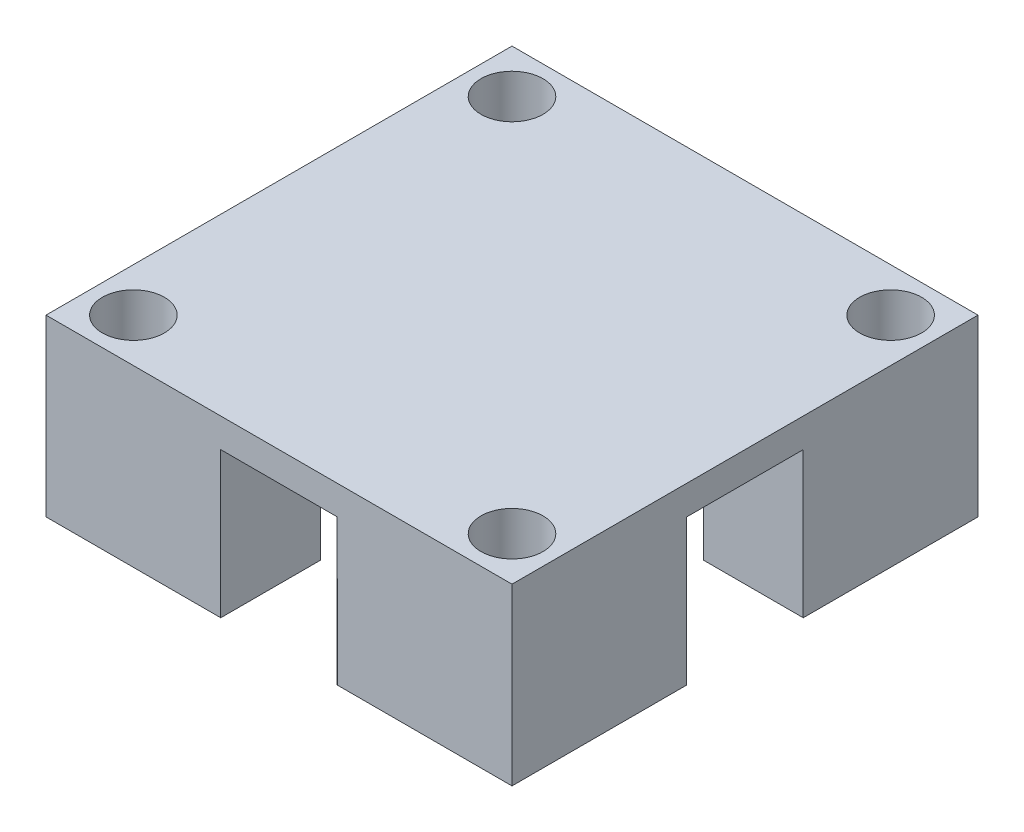
ISO-10303-21;
HEADER;
FILE_DESCRIPTION(('STEP AP214'),'2;1');
FILE_NAME('part.step','',(''),(''),'','','');
FILE_SCHEMA(('AUTOMOTIVE_DESIGN { 1 0 10303 214 1 1 1 1 }'));
ENDSEC;
DATA;
#1=APPLICATION_CONTEXT('core data for automotive mechanical design processes');
#2=APPLICATION_PROTOCOL_DEFINITION('international standard','automotive_design',2000,#1);
#3=PRODUCT_CONTEXT('',#1,'mechanical');
#4=PRODUCT('Part','Part','',(#3));
#5=PRODUCT_RELATED_PRODUCT_CATEGORY('part','',(#4));
#6=PRODUCT_DEFINITION_FORMATION('','',#4);
#7=PRODUCT_DEFINITION_CONTEXT('part definition',#1,'design');
#8=PRODUCT_DEFINITION('design','',#6,#7);
#9=PRODUCT_DEFINITION_SHAPE('','',#8);
#10=(LENGTH_UNIT() NAMED_UNIT(*) SI_UNIT(.MILLI.,.METRE.));
#11=(NAMED_UNIT(*) PLANE_ANGLE_UNIT() SI_UNIT($,.RADIAN.));
#12=(NAMED_UNIT(*) SI_UNIT($,.STERADIAN.) SOLID_ANGLE_UNIT());
#13=UNCERTAINTY_MEASURE_WITH_UNIT(LENGTH_MEASURE(1.E-05),#10,'distance_accuracy_value','');
#14=(GEOMETRIC_REPRESENTATION_CONTEXT(3) GLOBAL_UNCERTAINTY_ASSIGNED_CONTEXT((#13)) GLOBAL_UNIT_ASSIGNED_CONTEXT((#10,
#11,#12)) REPRESENTATION_CONTEXT('',''));
#15=CARTESIAN_POINT('',(0.,0.,0.));
#16=DIRECTION('',(0.,0.,1.));
#17=DIRECTION('',(1.,0.,0.));
#18=AXIS2_PLACEMENT_3D('',#15,#16,#17);
#19=CARTESIAN_POINT('',(25.4,19.05,-25.4));
#20=DIRECTION('',(-1.,0.,0.));
#21=DIRECTION('',(0.,0.,1.));
#22=AXIS2_PLACEMENT_3D('',#19,#20,#21);
#23=PLANE('',#22);
#24=DIRECTION('',(0.,-1.,0.));
#25=VECTOR('',#24,1.);
#26=CARTESIAN_POINT('',(25.4,15.875,6.35));
#27=LINE('',#26,#25);
#28=CARTESIAN_POINT('',(25.4,15.875,6.35));
#29=VERTEX_POINT('',#28);
#30=CARTESIAN_POINT('',(25.4,0.,6.35));
#31=VERTEX_POINT('',#30);
#32=EDGE_CURVE('E297',#29,#31,#27,.T.);
#33=ORIENTED_EDGE('',*,*,#32,.F.);
#34=DIRECTION('',(0.,0.,1.));
#35=VECTOR('',#34,1.);
#36=CARTESIAN_POINT('',(25.4,15.875,0.));
#37=LINE('',#36,#35);
#38=CARTESIAN_POINT('',(25.4,15.875,-6.35));
#39=VERTEX_POINT('',#38);
#40=EDGE_CURVE('E195',#39,#29,#37,.T.);
#41=ORIENTED_EDGE('',*,*,#40,.F.);
#42=DIRECTION('',(0.,-1.,0.));
#43=VECTOR('',#42,1.);
#44=CARTESIAN_POINT('',(25.4,15.875,-6.35));
#45=LINE('',#44,#43);
#46=CARTESIAN_POINT('',(25.4,0.,-6.35));
#47=VERTEX_POINT('',#46);
#48=EDGE_CURVE('E185',#39,#47,#45,.T.);
#49=ORIENTED_EDGE('',*,*,#48,.T.);
#50=DIRECTION('',(0.,0.,-1.));
#51=VECTOR('',#50,1.);
#52=CARTESIAN_POINT('',(25.4,0.,-25.4));
#53=LINE('',#52,#51);
#54=CARTESIAN_POINT('',(25.4,0.,-25.4));
#55=VERTEX_POINT('',#54);
#56=EDGE_CURVE('E323',#47,#55,#53,.T.);
#57=ORIENTED_EDGE('',*,*,#56,.T.);
#58=DIRECTION('',(0.,-1.,0.));
#59=VECTOR('',#58,1.);
#60=CARTESIAN_POINT('',(25.4,19.05,-25.4));
#61=LINE('',#60,#59);
#62=CARTESIAN_POINT('',(25.4,19.05,-25.4));
#63=VERTEX_POINT('',#62);
#64=EDGE_CURVE('E11',#63,#55,#61,.T.);
#65=ORIENTED_EDGE('',*,*,#64,.F.);
#66=DIRECTION('',(0.,0.,-1.));
#67=VECTOR('',#66,1.);
#68=CARTESIAN_POINT('',(25.4,19.05,-25.4));
#69=LINE('',#68,#67);
#70=CARTESIAN_POINT('',(25.4,19.05,25.4));
#71=VERTEX_POINT('',#70);
#72=EDGE_CURVE('E324',#71,#63,#69,.T.);
#73=ORIENTED_EDGE('',*,*,#72,.F.);
#74=DIRECTION('',(0.,-1.,0.));
#75=VECTOR('',#74,1.);
#76=CARTESIAN_POINT('',(25.4,19.05,25.4));
#77=LINE('',#76,#75);
#78=CARTESIAN_POINT('',(25.4,0.,25.4));
#79=VERTEX_POINT('',#78);
#80=EDGE_CURVE('E331',#71,#79,#77,.T.);
#81=ORIENTED_EDGE('',*,*,#80,.T.);
#82=EDGE_CURVE('E332',#79,#31,#53,.T.);
#83=ORIENTED_EDGE('',*,*,#82,.T.);
#84=EDGE_LOOP('',(#33,#41,#49,#57,#65,#73,#81,#83));
#85=FACE_BOUND('',#84,.T.);
#86=ADVANCED_FACE('F35',(#85),#23,.F.);
#87=CARTESIAN_POINT('',(-25.4,19.05,-25.4));
#88=DIRECTION('',(0.,0.,1.));
#89=DIRECTION('',(1.,0.,0.));
#90=AXIS2_PLACEMENT_3D('',#87,#88,#89);
#91=PLANE('',#90);
#92=DIRECTION('',(0.,-1.,0.));
#93=VECTOR('',#92,1.);
#94=CARTESIAN_POINT('',(6.35,15.875,-25.4));
#95=LINE('',#94,#93);
#96=CARTESIAN_POINT('',(6.35,15.875,-25.4));
#97=VERTEX_POINT('',#96);
#98=CARTESIAN_POINT('',(6.35,0.,-25.4));
#99=VERTEX_POINT('',#98);
#100=EDGE_CURVE('E271',#97,#99,#95,.T.);
#101=ORIENTED_EDGE('',*,*,#100,.F.);
#102=DIRECTION('',(1.,0.,0.));
#103=VECTOR('',#102,1.);
#104=CARTESIAN_POINT('',(0.,15.875,-25.4));
#105=LINE('',#104,#103);
#106=CARTESIAN_POINT('',(-6.35,15.875,-25.4));
#107=VERTEX_POINT('',#106);
#108=EDGE_CURVE('E237',#107,#97,#105,.T.);
#109=ORIENTED_EDGE('',*,*,#108,.F.);
#110=DIRECTION('',(0.,-1.,0.));
#111=VECTOR('',#110,1.);
#112=CARTESIAN_POINT('',(-6.35,15.875,-25.4));
#113=LINE('',#112,#111);
#114=CARTESIAN_POINT('',(-6.35,0.,-25.4));
#115=VERTEX_POINT('',#114);
#116=EDGE_CURVE('E273',#107,#115,#113,.T.);
#117=ORIENTED_EDGE('',*,*,#116,.T.);
#118=DIRECTION('',(-1.,0.,0.));
#119=VECTOR('',#118,1.);
#120=CARTESIAN_POINT('',(-25.4,0.,-25.4));
#121=LINE('',#120,#119);
#122=CARTESIAN_POINT('',(-25.4,0.,-25.4));
#123=VERTEX_POINT('',#122);
#124=EDGE_CURVE('E335',#115,#123,#121,.T.);
#125=ORIENTED_EDGE('',*,*,#124,.T.);
#126=DIRECTION('',(0.,-1.,0.));
#127=VECTOR('',#126,1.);
#128=CARTESIAN_POINT('',(-25.4,19.05,-25.4));
#129=LINE('',#128,#127);
#130=CARTESIAN_POINT('',(-25.4,19.05,-25.4));
#131=VERTEX_POINT('',#130);
#132=EDGE_CURVE('E42',#131,#123,#129,.T.);
#133=ORIENTED_EDGE('',*,*,#132,.F.);
#134=DIRECTION('',(-1.,0.,0.));
#135=VECTOR('',#134,1.);
#136=CARTESIAN_POINT('',(-25.4,19.05,-25.4));
#137=LINE('',#136,#135);
#138=EDGE_CURVE('E86',#63,#131,#137,.T.);
#139=ORIENTED_EDGE('',*,*,#138,.F.);
#140=ORIENTED_EDGE('',*,*,#64,.T.);
#141=EDGE_CURVE('E336',#55,#99,#121,.T.);
#142=ORIENTED_EDGE('',*,*,#141,.T.);
#143=EDGE_LOOP('',(#101,#109,#117,#125,#133,#139,#140,#142));
#144=FACE_BOUND('',#143,.T.);
#145=ADVANCED_FACE('F402',(#144),#91,.F.);
#146=CARTESIAN_POINT('',(0.,0.,0.));
#147=DIRECTION('',(0.,1.,0.));
#148=DIRECTION('',(0.,0.,1.));
#149=AXIS2_PLACEMENT_3D('',#146,#147,#148);
#150=PLANE('',#149);
#151=CARTESIAN_POINT('',(-20.6375,0.,20.6375));
#152=DIRECTION('',(0.,1.,0.));
#153=DIRECTION('',(0.,0.,1.));
#154=AXIS2_PLACEMENT_3D('',#151,#152,#153);
#155=CIRCLE('',#154,3.37819999999999);
#156=CARTESIAN_POINT('',(-20.6375,0.,24.0157));
#157=VERTEX_POINT('',#156);
#158=EDGE_CURVE('E320',#157,#157,#155,.T.);
#159=ORIENTED_EDGE('',*,*,#158,.T.);
#160=EDGE_LOOP('',(#159));
#161=FACE_BOUND('',#160,.T.);
#162=DIRECTION('',(1.,0.,0.));
#163=VECTOR('',#162,1.);
#164=CARTESIAN_POINT('',(0.,0.,6.35));
#165=LINE('',#164,#163);
#166=CARTESIAN_POINT('',(-25.4,0.,6.35));
#167=VERTEX_POINT('',#166);
#168=CARTESIAN_POINT('',(-14.5496778314848,0.,6.35));
#169=VERTEX_POINT('',#168);
#170=EDGE_CURVE('E258',#167,#169,#165,.T.);
#171=ORIENTED_EDGE('',*,*,#170,.T.);
#172=CARTESIAN_POINT('',(0.,0.,0.));
#173=DIRECTION('',(0.,-1.,0.));
#174=DIRECTION('',(0.,0.,-1.));
#175=AXIS2_PLACEMENT_3D('',#172,#173,#174);
#176=CIRCLE('',#175,15.875);
#177=CARTESIAN_POINT('',(-6.35,0.,14.5496778314848));
#178=VERTEX_POINT('',#177);
#179=EDGE_CURVE('E255',#178,#169,#176,.T.);
#180=ORIENTED_EDGE('',*,*,#179,.F.);
#181=DIRECTION('',(0.,0.,-1.));
#182=VECTOR('',#181,1.);
#183=CARTESIAN_POINT('',(-6.35,0.,0.));
#184=LINE('',#183,#182);
#185=CARTESIAN_POINT('',(-6.35,0.,25.4));
#186=VERTEX_POINT('',#185);
#187=EDGE_CURVE('E252',#186,#178,#184,.T.);
#188=ORIENTED_EDGE('',*,*,#187,.F.);
#189=DIRECTION('',(1.,0.,0.));
#190=VECTOR('',#189,1.);
#191=CARTESIAN_POINT('',(-25.4,0.,25.4));
#192=LINE('',#191,#190);
#193=CARTESIAN_POINT('',(-25.4,0.,25.4));
#194=VERTEX_POINT('',#193);
#195=EDGE_CURVE('E326',#194,#186,#192,.T.);
#196=ORIENTED_EDGE('',*,*,#195,.F.);
#197=DIRECTION('',(0.,0.,1.));
#198=VECTOR('',#197,1.);
#199=CARTESIAN_POINT('',(-25.4,0.,-25.4));
#200=LINE('',#199,#198);
#201=EDGE_CURVE('E339',#167,#194,#200,.T.);
#202=ORIENTED_EDGE('',*,*,#201,.F.);
#203=EDGE_LOOP('',(#171,#180,#188,#196,#202));
#204=FACE_BOUND('',#203,.T.);
#205=ADVANCED_FACE('F376',(#161,#204),#150,.F.);
#206=CARTESIAN_POINT('',(20.6375,0.,20.6375));
#207=DIRECTION('',(0.,1.,0.));
#208=DIRECTION('',(0.,0.,1.));
#209=AXIS2_PLACEMENT_3D('',#206,#207,#208);
#210=CIRCLE('',#209,3.37819999999999);
#211=CARTESIAN_POINT('',(20.6375,0.,24.0157));
#212=VERTEX_POINT('',#211);
#213=EDGE_CURVE('E314',#212,#212,#210,.T.);
#214=ORIENTED_EDGE('',*,*,#213,.T.);
#215=EDGE_LOOP('',(#214));
#216=FACE_BOUND('',#215,.T.);
#217=DIRECTION('',(0.,0.,-1.));
#218=VECTOR('',#217,1.);
#219=CARTESIAN_POINT('',(6.35,0.,0.));
#220=LINE('',#219,#218);
#221=CARTESIAN_POINT('',(6.35,0.,25.4));
#222=VERTEX_POINT('',#221);
#223=CARTESIAN_POINT('',(6.35,0.,14.5496778314848));
#224=VERTEX_POINT('',#223);
#225=EDGE_CURVE('E249',#222,#224,#220,.T.);
#226=ORIENTED_EDGE('',*,*,#225,.T.);
#227=CARTESIAN_POINT('',(0.,0.,0.));
#228=DIRECTION('',(0.,-1.,0.));
#229=DIRECTION('',(0.,0.,-1.));
#230=AXIS2_PLACEMENT_3D('',#227,#228,#229);
#231=CIRCLE('',#230,15.875);
#232=CARTESIAN_POINT('',(14.5496778314848,0.,6.35));
#233=VERTEX_POINT('',#232);
#234=EDGE_CURVE('E246',#233,#224,#231,.T.);
#235=ORIENTED_EDGE('',*,*,#234,.F.);
#236=DIRECTION('',(1.,0.,0.));
#237=VECTOR('',#236,1.);
#238=CARTESIAN_POINT('',(0.,0.,6.35));
#239=LINE('',#238,#237);
#240=EDGE_CURVE('E243',#233,#31,#239,.T.);
#241=ORIENTED_EDGE('',*,*,#240,.T.);
#242=ORIENTED_EDGE('',*,*,#82,.F.);
#243=EDGE_CURVE('E79',#222,#79,#192,.T.);
#244=ORIENTED_EDGE('',*,*,#243,.F.);
#245=EDGE_LOOP('',(#226,#235,#241,#242,#244));
#246=FACE_BOUND('',#245,.T.);
#247=ADVANCED_FACE('F409',(#216,#246),#150,.F.);
#248=CARTESIAN_POINT('',(20.6375,0.,-20.6375));
#249=DIRECTION('',(0.,1.,0.));
#250=DIRECTION('',(0.,0.,1.));
#251=AXIS2_PLACEMENT_3D('',#248,#249,#250);
#252=CIRCLE('',#251,3.37819999999999);
#253=CARTESIAN_POINT('',(20.6375,0.,-17.2593));
#254=VERTEX_POINT('',#253);
#255=EDGE_CURVE('E308',#254,#254,#252,.T.);
#256=ORIENTED_EDGE('',*,*,#255,.T.);
#257=EDGE_LOOP('',(#256));
#258=FACE_BOUND('',#257,.T.);
#259=DIRECTION('',(0.,0.,-1.));
#260=VECTOR('',#259,1.);
#261=CARTESIAN_POINT('',(6.35,0.,0.));
#262=LINE('',#261,#260);
#263=CARTESIAN_POINT('',(6.35,0.,-14.5496778314848));
#264=VERTEX_POINT('',#263);
#265=EDGE_CURVE('E200',#264,#99,#262,.T.);
#266=ORIENTED_EDGE('',*,*,#265,.T.);
#267=ORIENTED_EDGE('',*,*,#141,.F.);
#268=ORIENTED_EDGE('',*,*,#56,.F.);
#269=DIRECTION('',(1.,0.,0.));
#270=VECTOR('',#269,1.);
#271=CARTESIAN_POINT('',(0.,0.,-6.35));
#272=LINE('',#271,#270);
#273=CARTESIAN_POINT('',(14.5496778314848,0.,-6.35));
#274=VERTEX_POINT('',#273);
#275=EDGE_CURVE('E241',#274,#47,#272,.T.);
#276=ORIENTED_EDGE('',*,*,#275,.F.);
#277=CARTESIAN_POINT('',(0.,0.,0.));
#278=DIRECTION('',(0.,-1.,0.));
#279=DIRECTION('',(0.,0.,-1.));
#280=AXIS2_PLACEMENT_3D('',#277,#278,#279);
#281=CIRCLE('',#280,15.875);
#282=EDGE_CURVE('E49',#264,#274,#281,.T.);
#283=ORIENTED_EDGE('',*,*,#282,.F.);
#284=EDGE_LOOP('',(#266,#267,#268,#276,#283));
#285=FACE_BOUND('',#284,.T.);
#286=ADVANCED_FACE('F396',(#258,#285),#150,.F.);
#287=CARTESIAN_POINT('',(-25.4,19.05,-25.4));
#288=DIRECTION('',(1.,0.,0.));
#289=DIRECTION('',(0.,0.,-1.));
#290=AXIS2_PLACEMENT_3D('',#287,#288,#289);
#291=PLANE('',#290);
#292=CARTESIAN_POINT('',(-25.4,0.,-6.35));
#293=VERTEX_POINT('',#292);
#294=EDGE_CURVE('E340',#123,#293,#200,.T.);
#295=ORIENTED_EDGE('',*,*,#294,.T.);
#296=DIRECTION('',(0.,-1.,0.));
#297=VECTOR('',#296,1.);
#298=CARTESIAN_POINT('',(-25.4,15.875,-6.35));
#299=LINE('',#298,#297);
#300=CARTESIAN_POINT('',(-25.4,15.875,-6.35));
#301=VERTEX_POINT('',#300);
#302=EDGE_CURVE('E280',#301,#293,#299,.T.);
#303=ORIENTED_EDGE('',*,*,#302,.F.);
#304=DIRECTION('',(0.,0.,-1.));
#305=VECTOR('',#304,1.);
#306=CARTESIAN_POINT('',(-25.4,15.875,0.));
#307=LINE('',#306,#305);
#308=CARTESIAN_POINT('',(-25.4,15.875,6.35));
#309=VERTEX_POINT('',#308);
#310=EDGE_CURVE('E225',#309,#301,#307,.T.);
#311=ORIENTED_EDGE('',*,*,#310,.F.);
#312=DIRECTION('',(0.,-1.,0.));
#313=VECTOR('',#312,1.);
#314=CARTESIAN_POINT('',(-25.4,15.875,6.35));
#315=LINE('',#314,#313);
#316=EDGE_CURVE('E282',#309,#167,#315,.T.);
#317=ORIENTED_EDGE('',*,*,#316,.T.);
#318=ORIENTED_EDGE('',*,*,#201,.T.);
#319=DIRECTION('',(0.,-1.,0.));
#320=VECTOR('',#319,1.);
#321=CARTESIAN_POINT('',(-25.4,19.05,25.4));
#322=LINE('',#321,#320);
#323=CARTESIAN_POINT('',(-25.4,19.05,25.4));
#324=VERTEX_POINT('',#323);
#325=EDGE_CURVE('E346',#324,#194,#322,.T.);
#326=ORIENTED_EDGE('',*,*,#325,.F.);
#327=DIRECTION('',(0.,0.,1.));
#328=VECTOR('',#327,1.);
#329=CARTESIAN_POINT('',(-25.4,19.05,-25.4));
#330=LINE('',#329,#328);
#331=EDGE_CURVE('E328',#131,#324,#330,.T.);
#332=ORIENTED_EDGE('',*,*,#331,.F.);
#333=ORIENTED_EDGE('',*,*,#132,.T.);
#334=EDGE_LOOP('',(#295,#303,#311,#317,#318,#326,#332,#333));
#335=FACE_BOUND('',#334,.T.);
#336=ADVANCED_FACE('F352',(#335),#291,.F.);
#337=CARTESIAN_POINT('',(-25.4,19.05,25.4));
#338=DIRECTION('',(0.,0.,-1.));
#339=DIRECTION('',(-1.,0.,0.));
#340=AXIS2_PLACEMENT_3D('',#337,#338,#339);
#341=PLANE('',#340);
#342=ORIENTED_EDGE('',*,*,#195,.T.);
#343=DIRECTION('',(0.,-1.,0.));
#344=VECTOR('',#343,1.);
#345=CARTESIAN_POINT('',(-6.35,15.875,25.4));
#346=LINE('',#345,#344);
#347=CARTESIAN_POINT('',(-6.35,15.875,25.4));
#348=VERTEX_POINT('',#347);
#349=EDGE_CURVE('E289',#348,#186,#346,.T.);
#350=ORIENTED_EDGE('',*,*,#349,.F.);
#351=DIRECTION('',(-1.,0.,0.));
#352=VECTOR('',#351,1.);
#353=CARTESIAN_POINT('',(0.,15.875,25.4));
#354=LINE('',#353,#352);
#355=CARTESIAN_POINT('',(6.35,15.875,25.4));
#356=VERTEX_POINT('',#355);
#357=EDGE_CURVE('E214',#356,#348,#354,.T.);
#358=ORIENTED_EDGE('',*,*,#357,.F.);
#359=DIRECTION('',(0.,-1.,0.));
#360=VECTOR('',#359,1.);
#361=CARTESIAN_POINT('',(6.35,15.875,25.4));
#362=LINE('',#361,#360);
#363=EDGE_CURVE('E291',#356,#222,#362,.T.);
#364=ORIENTED_EDGE('',*,*,#363,.T.);
#365=ORIENTED_EDGE('',*,*,#243,.T.);
#366=ORIENTED_EDGE('',*,*,#80,.F.);
#367=DIRECTION('',(1.,0.,0.));
#368=VECTOR('',#367,1.);
#369=CARTESIAN_POINT('',(-25.4,19.05,25.4));
#370=LINE('',#369,#368);
#371=EDGE_CURVE('E58',#324,#71,#370,.T.);
#372=ORIENTED_EDGE('',*,*,#371,.F.);
#373=ORIENTED_EDGE('',*,*,#325,.T.);
#374=EDGE_LOOP('',(#342,#350,#358,#364,#365,#366,#372,#373));
#375=FACE_BOUND('',#374,.T.);
#376=ADVANCED_FACE('F378',(#375),#341,.F.);
#377=CARTESIAN_POINT('',(0.,19.05,0.));
#378=DIRECTION('',(0.,1.,0.));
#379=DIRECTION('',(0.,0.,1.));
#380=AXIS2_PLACEMENT_3D('',#377,#378,#379);
#381=PLANE('',#380);
#382=CARTESIAN_POINT('',(-20.6375,19.05,-20.6375));
#383=DIRECTION('',(0.,1.,0.));
#384=DIRECTION('',(0.,0.,1.));
#385=AXIS2_PLACEMENT_3D('',#382,#383,#384);
#386=CIRCLE('',#385,3.37819999999999);
#387=CARTESIAN_POINT('',(-20.6375,19.05,-17.2593));
#388=VERTEX_POINT('',#387);
#389=EDGE_CURVE('E270',#388,#388,#386,.T.);
#390=ORIENTED_EDGE('',*,*,#389,.F.);
#391=EDGE_LOOP('',(#390));
#392=FACE_BOUND('',#391,.T.);
#393=CARTESIAN_POINT('',(20.6375,19.05,-20.6375));
#394=DIRECTION('',(0.,1.,0.));
#395=DIRECTION('',(0.,0.,1.));
#396=AXIS2_PLACEMENT_3D('',#393,#394,#395);
#397=CIRCLE('',#396,3.37819999999999);
#398=CARTESIAN_POINT('',(20.6375,19.05,-17.2593));
#399=VERTEX_POINT('',#398);
#400=EDGE_CURVE('E305',#399,#399,#397,.T.);
#401=ORIENTED_EDGE('',*,*,#400,.F.);
#402=EDGE_LOOP('',(#401));
#403=FACE_BOUND('',#402,.T.);
#404=CARTESIAN_POINT('',(20.6375,19.05,20.6375));
#405=DIRECTION('',(0.,1.,0.));
#406=DIRECTION('',(0.,0.,1.));
#407=AXIS2_PLACEMENT_3D('',#404,#405,#406);
#408=CIRCLE('',#407,3.37819999999999);
#409=CARTESIAN_POINT('',(20.6375,19.05,24.0157));
#410=VERTEX_POINT('',#409);
#411=EDGE_CURVE('E311',#410,#410,#408,.T.);
#412=ORIENTED_EDGE('',*,*,#411,.F.);
#413=EDGE_LOOP('',(#412));
#414=FACE_BOUND('',#413,.T.);
#415=CARTESIAN_POINT('',(-20.6375,19.05,20.6375));
#416=DIRECTION('',(0.,1.,0.));
#417=DIRECTION('',(0.,0.,1.));
#418=AXIS2_PLACEMENT_3D('',#415,#416,#417);
#419=CIRCLE('',#418,3.37819999999999);
#420=CARTESIAN_POINT('',(-20.6375,19.05,24.0157));
#421=VERTEX_POINT('',#420);
#422=EDGE_CURVE('E317',#421,#421,#419,.T.);
#423=ORIENTED_EDGE('',*,*,#422,.F.);
#424=EDGE_LOOP('',(#423));
#425=FACE_BOUND('',#424,.T.);
#426=ORIENTED_EDGE('',*,*,#72,.T.);
#427=ORIENTED_EDGE('',*,*,#138,.T.);
#428=ORIENTED_EDGE('',*,*,#331,.T.);
#429=ORIENTED_EDGE('',*,*,#371,.T.);
#430=EDGE_LOOP('',(#426,#427,#428,#429));
#431=FACE_BOUND('',#430,.T.);
#432=ADVANCED_FACE('F385',(#392,#403,#414,#425,#431),#381,.T.);
#433=CARTESIAN_POINT('',(-20.6375,0.,-20.6375));
#434=DIRECTION('',(0.,1.,0.));
#435=DIRECTION('',(0.,0.,1.));
#436=AXIS2_PLACEMENT_3D('',#433,#434,#435);
#437=CIRCLE('',#436,3.37819999999999);
#438=CARTESIAN_POINT('',(-20.6375,0.,-17.2593));
#439=VERTEX_POINT('',#438);
#440=EDGE_CURVE('E302',#439,#439,#437,.T.);
#441=ORIENTED_EDGE('',*,*,#440,.T.);
#442=EDGE_LOOP('',(#441));
#443=FACE_BOUND('',#442,.T.);
#444=ORIENTED_EDGE('',*,*,#124,.F.);
#445=DIRECTION('',(0.,0.,-1.));
#446=VECTOR('',#445,1.);
#447=CARTESIAN_POINT('',(-6.35,0.,0.));
#448=LINE('',#447,#446);
#449=CARTESIAN_POINT('',(-6.35,0.,-14.5496778314848));
#450=VERTEX_POINT('',#449);
#451=EDGE_CURVE('E203',#450,#115,#448,.T.);
#452=ORIENTED_EDGE('',*,*,#451,.F.);
#453=CARTESIAN_POINT('',(0.,0.,0.));
#454=DIRECTION('',(0.,-1.,0.));
#455=DIRECTION('',(0.,0.,-1.));
#456=AXIS2_PLACEMENT_3D('',#453,#454,#455);
#457=CIRCLE('',#456,15.875);
#458=CARTESIAN_POINT('',(-14.5496778314848,0.,-6.35));
#459=VERTEX_POINT('',#458);
#460=EDGE_CURVE('E264',#459,#450,#457,.T.);
#461=ORIENTED_EDGE('',*,*,#460,.F.);
#462=DIRECTION('',(1.,0.,0.));
#463=VECTOR('',#462,1.);
#464=CARTESIAN_POINT('',(0.,0.,-6.35));
#465=LINE('',#464,#463);
#466=EDGE_CURVE('E261',#293,#459,#465,.T.);
#467=ORIENTED_EDGE('',*,*,#466,.F.);
#468=ORIENTED_EDGE('',*,*,#294,.F.);
#469=EDGE_LOOP('',(#444,#452,#461,#467,#468));
#470=FACE_BOUND('',#469,.T.);
#471=ADVANCED_FACE('F358',(#443,#470),#150,.F.);
#472=CARTESIAN_POINT('',(-20.6375,19.05,20.6375));
#473=DIRECTION('',(0.,1.,0.));
#474=DIRECTION('',(0.,0.,1.));
#475=AXIS2_PLACEMENT_3D('',#472,#473,#474);
#476=CYLINDRICAL_SURFACE('',#475,3.37819999999999);
#477=ORIENTED_EDGE('',*,*,#158,.F.);
#478=EDGE_LOOP('',(#477));
#479=FACE_BOUND('',#478,.T.);
#480=ORIENTED_EDGE('',*,*,#422,.T.);
#481=EDGE_LOOP('',(#480));
#482=FACE_BOUND('',#481,.T.);
#483=ADVANCED_FACE('F393',(#479,#482),#476,.F.);
#484=CARTESIAN_POINT('',(20.6375,19.05,20.6375));
#485=DIRECTION('',(0.,1.,0.));
#486=DIRECTION('',(0.,0.,1.));
#487=AXIS2_PLACEMENT_3D('',#484,#485,#486);
#488=CYLINDRICAL_SURFACE('',#487,3.37819999999999);
#489=ORIENTED_EDGE('',*,*,#213,.F.);
#490=EDGE_LOOP('',(#489));
#491=FACE_BOUND('',#490,.T.);
#492=ORIENTED_EDGE('',*,*,#411,.T.);
#493=EDGE_LOOP('',(#492));
#494=FACE_BOUND('',#493,.T.);
#495=ADVANCED_FACE('F476',(#491,#494),#488,.F.);
#496=CARTESIAN_POINT('',(20.6375,19.05,-20.6375));
#497=DIRECTION('',(0.,1.,0.));
#498=DIRECTION('',(0.,0.,1.));
#499=AXIS2_PLACEMENT_3D('',#496,#497,#498);
#500=CYLINDRICAL_SURFACE('',#499,3.37819999999999);
#501=ORIENTED_EDGE('',*,*,#255,.F.);
#502=EDGE_LOOP('',(#501));
#503=FACE_BOUND('',#502,.T.);
#504=ORIENTED_EDGE('',*,*,#400,.T.);
#505=EDGE_LOOP('',(#504));
#506=FACE_BOUND('',#505,.T.);
#507=ADVANCED_FACE('F472',(#503,#506),#500,.F.);
#508=CARTESIAN_POINT('',(-20.6375,19.05,-20.6375));
#509=DIRECTION('',(0.,1.,0.));
#510=DIRECTION('',(0.,0.,1.));
#511=AXIS2_PLACEMENT_3D('',#508,#509,#510);
#512=CYLINDRICAL_SURFACE('',#511,3.37819999999999);
#513=ORIENTED_EDGE('',*,*,#440,.F.);
#514=EDGE_LOOP('',(#513));
#515=FACE_BOUND('',#514,.T.);
#516=ORIENTED_EDGE('',*,*,#389,.T.);
#517=EDGE_LOOP('',(#516));
#518=FACE_BOUND('',#517,.T.);
#519=ADVANCED_FACE('F469',(#515,#518),#512,.F.);
#520=CARTESIAN_POINT('',(0.,15.875,0.));
#521=DIRECTION('',(0.,-1.,0.));
#522=DIRECTION('',(0.,0.,-1.));
#523=AXIS2_PLACEMENT_3D('',#520,#521,#522);
#524=CYLINDRICAL_SURFACE('',#523,15.875);
#525=ORIENTED_EDGE('',*,*,#282,.T.);
#526=DIRECTION('',(0.,-1.,0.));
#527=VECTOR('',#526,1.);
#528=CARTESIAN_POINT('',(14.5496778314848,15.875,-6.35));
#529=LINE('',#528,#527);
#530=CARTESIAN_POINT('',(14.5496778314848,15.875,-6.35));
#531=VERTEX_POINT('',#530);
#532=EDGE_CURVE('E178',#531,#274,#529,.T.);
#533=ORIENTED_EDGE('',*,*,#532,.F.);
#534=CARTESIAN_POINT('',(0.,15.875,0.));
#535=DIRECTION('',(0.,-1.,0.));
#536=DIRECTION('',(0.,0.,-1.));
#537=AXIS2_PLACEMENT_3D('',#534,#535,#536);
#538=CIRCLE('',#537,15.875);
#539=CARTESIAN_POINT('',(6.35,15.875,-14.5496778314848));
#540=VERTEX_POINT('',#539);
#541=EDGE_CURVE('E182',#540,#531,#538,.T.);
#542=ORIENTED_EDGE('',*,*,#541,.F.);
#543=DIRECTION('',(0.,-1.,0.));
#544=VECTOR('',#543,1.);
#545=CARTESIAN_POINT('',(6.35,15.875,-14.5496778314848));
#546=LINE('',#545,#544);
#547=EDGE_CURVE('E268',#540,#264,#546,.T.);
#548=ORIENTED_EDGE('',*,*,#547,.T.);
#549=EDGE_LOOP('',(#525,#533,#542,#548));
#550=FACE_BOUND('',#549,.T.);
#551=ADVANCED_FACE('F180',(#550),#524,.F.);
#552=CARTESIAN_POINT('',(6.35,15.875,0.));
#553=DIRECTION('',(-1.,0.,0.));
#554=DIRECTION('',(0.,0.,1.));
#555=AXIS2_PLACEMENT_3D('',#552,#553,#554);
#556=PLANE('',#555);
#557=ORIENTED_EDGE('',*,*,#265,.F.);
#558=ORIENTED_EDGE('',*,*,#547,.F.);
#559=DIRECTION('',(0.,0.,-1.));
#560=VECTOR('',#559,1.);
#561=CARTESIAN_POINT('',(6.35,15.875,0.));
#562=LINE('',#561,#560);
#563=EDGE_CURVE('E186',#540,#97,#562,.T.);
#564=ORIENTED_EDGE('',*,*,#563,.T.);
#565=ORIENTED_EDGE('',*,*,#100,.T.);
#566=EDGE_LOOP('',(#557,#558,#564,#565));
#567=FACE_BOUND('',#566,.T.);
#568=ADVANCED_FACE('F429',(#567),#556,.T.);
#569=CARTESIAN_POINT('',(-6.35,15.875,0.));
#570=DIRECTION('',(-1.,0.,0.));
#571=DIRECTION('',(0.,0.,1.));
#572=AXIS2_PLACEMENT_3D('',#569,#570,#571);
#573=PLANE('',#572);
#574=ORIENTED_EDGE('',*,*,#451,.T.);
#575=ORIENTED_EDGE('',*,*,#116,.F.);
#576=DIRECTION('',(0.,0.,-1.));
#577=VECTOR('',#576,1.);
#578=CARTESIAN_POINT('',(-6.35,15.875,0.));
#579=LINE('',#578,#577);
#580=CARTESIAN_POINT('',(-6.35,15.875,-14.5496778314848));
#581=VERTEX_POINT('',#580);
#582=EDGE_CURVE('E234',#581,#107,#579,.T.);
#583=ORIENTED_EDGE('',*,*,#582,.F.);
#584=DIRECTION('',(0.,-1.,0.));
#585=VECTOR('',#584,1.);
#586=CARTESIAN_POINT('',(-6.35,15.875,-14.5496778314848));
#587=LINE('',#586,#585);
#588=EDGE_CURVE('E276',#581,#450,#587,.T.);
#589=ORIENTED_EDGE('',*,*,#588,.T.);
#590=EDGE_LOOP('',(#574,#575,#583,#589));
#591=FACE_BOUND('',#590,.T.);
#592=ADVANCED_FACE('F432',(#591),#573,.F.);
#593=CARTESIAN_POINT('',(0.,15.875,0.));
#594=DIRECTION('',(0.,-1.,0.));
#595=DIRECTION('',(0.,0.,-1.));
#596=AXIS2_PLACEMENT_3D('',#593,#594,#595);
#597=CYLINDRICAL_SURFACE('',#596,15.875);
#598=ORIENTED_EDGE('',*,*,#460,.T.);
#599=ORIENTED_EDGE('',*,*,#588,.F.);
#600=CARTESIAN_POINT('',(0.,15.875,0.));
#601=DIRECTION('',(0.,-1.,0.));
#602=DIRECTION('',(0.,0.,-1.));
#603=AXIS2_PLACEMENT_3D('',#600,#601,#602);
#604=CIRCLE('',#603,15.875);
#605=CARTESIAN_POINT('',(-14.5496778314848,15.875,-6.35));
#606=VERTEX_POINT('',#605);
#607=EDGE_CURVE('E231',#606,#581,#604,.T.);
#608=ORIENTED_EDGE('',*,*,#607,.F.);
#609=DIRECTION('',(0.,-1.,0.));
#610=VECTOR('',#609,1.);
#611=CARTESIAN_POINT('',(-14.5496778314848,15.875,-6.35));
#612=LINE('',#611,#610);
#613=EDGE_CURVE('E278',#606,#459,#612,.T.);
#614=ORIENTED_EDGE('',*,*,#613,.T.);
#615=EDGE_LOOP('',(#598,#599,#608,#614));
#616=FACE_BOUND('',#615,.T.);
#617=ADVANCED_FACE('F434',(#616),#597,.F.);
#618=CARTESIAN_POINT('',(0.,15.875,-6.35));
#619=DIRECTION('',(0.,0.,-1.));
#620=DIRECTION('',(-1.,0.,0.));
#621=AXIS2_PLACEMENT_3D('',#618,#619,#620);
#622=PLANE('',#621);
#623=ORIENTED_EDGE('',*,*,#466,.T.);
#624=ORIENTED_EDGE('',*,*,#613,.F.);
#625=DIRECTION('',(1.,0.,0.));
#626=VECTOR('',#625,1.);
#627=CARTESIAN_POINT('',(0.,15.875,-6.35));
#628=LINE('',#627,#626);
#629=EDGE_CURVE('E228',#301,#606,#628,.T.);
#630=ORIENTED_EDGE('',*,*,#629,.F.);
#631=ORIENTED_EDGE('',*,*,#302,.T.);
#632=EDGE_LOOP('',(#623,#624,#630,#631));
#633=FACE_BOUND('',#632,.T.);
#634=ADVANCED_FACE('F362',(#633),#622,.F.);
#635=CARTESIAN_POINT('',(0.,15.875,6.35));
#636=DIRECTION('',(0.,0.,-1.));
#637=DIRECTION('',(-1.,0.,0.));
#638=AXIS2_PLACEMENT_3D('',#635,#636,#637);
#639=PLANE('',#638);
#640=ORIENTED_EDGE('',*,*,#170,.F.);
#641=ORIENTED_EDGE('',*,*,#316,.F.);
#642=DIRECTION('',(1.,0.,0.));
#643=VECTOR('',#642,1.);
#644=CARTESIAN_POINT('',(0.,15.875,6.35));
#645=LINE('',#644,#643);
#646=CARTESIAN_POINT('',(-14.5496778314848,15.875,6.35));
#647=VERTEX_POINT('',#646);
#648=EDGE_CURVE('E223',#309,#647,#645,.T.);
#649=ORIENTED_EDGE('',*,*,#648,.T.);
#650=DIRECTION('',(0.,-1.,0.));
#651=VECTOR('',#650,1.);
#652=CARTESIAN_POINT('',(-14.5496778314848,15.875,6.35));
#653=LINE('',#652,#651);
#654=EDGE_CURVE('E285',#647,#169,#653,.T.);
#655=ORIENTED_EDGE('',*,*,#654,.T.);
#656=EDGE_LOOP('',(#640,#641,#649,#655));
#657=FACE_BOUND('',#656,.T.);
#658=ADVANCED_FACE('F370',(#657),#639,.T.);
#659=CARTESIAN_POINT('',(0.,15.875,0.));
#660=DIRECTION('',(0.,-1.,0.));
#661=DIRECTION('',(0.,0.,-1.));
#662=AXIS2_PLACEMENT_3D('',#659,#660,#661);
#663=CYLINDRICAL_SURFACE('',#662,15.875);
#664=ORIENTED_EDGE('',*,*,#179,.T.);
#665=ORIENTED_EDGE('',*,*,#654,.F.);
#666=CARTESIAN_POINT('',(0.,15.875,0.));
#667=DIRECTION('',(0.,-1.,0.));
#668=DIRECTION('',(0.,0.,-1.));
#669=AXIS2_PLACEMENT_3D('',#666,#667,#668);
#670=CIRCLE('',#669,15.875);
#671=CARTESIAN_POINT('',(-6.35,15.875,14.5496778314848));
#672=VERTEX_POINT('',#671);
#673=EDGE_CURVE('E220',#672,#647,#670,.T.);
#674=ORIENTED_EDGE('',*,*,#673,.F.);
#675=DIRECTION('',(0.,-1.,0.));
#676=VECTOR('',#675,1.);
#677=CARTESIAN_POINT('',(-6.35,15.875,14.5496778314848));
#678=LINE('',#677,#676);
#679=EDGE_CURVE('E287',#672,#178,#678,.T.);
#680=ORIENTED_EDGE('',*,*,#679,.T.);
#681=EDGE_LOOP('',(#664,#665,#674,#680));
#682=FACE_BOUND('',#681,.T.);
#683=ADVANCED_FACE('F372',(#682),#663,.F.);
#684=CARTESIAN_POINT('',(-6.35,15.875,0.));
#685=DIRECTION('',(-1.,0.,0.));
#686=DIRECTION('',(0.,0.,1.));
#687=AXIS2_PLACEMENT_3D('',#684,#685,#686);
#688=PLANE('',#687);
#689=ORIENTED_EDGE('',*,*,#187,.T.);
#690=ORIENTED_EDGE('',*,*,#679,.F.);
#691=DIRECTION('',(0.,0.,-1.));
#692=VECTOR('',#691,1.);
#693=CARTESIAN_POINT('',(-6.35,15.875,0.));
#694=LINE('',#693,#692);
#695=EDGE_CURVE('E217',#348,#672,#694,.T.);
#696=ORIENTED_EDGE('',*,*,#695,.F.);
#697=ORIENTED_EDGE('',*,*,#349,.T.);
#698=EDGE_LOOP('',(#689,#690,#696,#697));
#699=FACE_BOUND('',#698,.T.);
#700=ADVANCED_FACE('F449',(#699),#688,.F.);
#701=CARTESIAN_POINT('',(6.35,15.875,0.));
#702=DIRECTION('',(-1.,0.,0.));
#703=DIRECTION('',(0.,0.,1.));
#704=AXIS2_PLACEMENT_3D('',#701,#702,#703);
#705=PLANE('',#704);
#706=ORIENTED_EDGE('',*,*,#225,.F.);
#707=ORIENTED_EDGE('',*,*,#363,.F.);
#708=DIRECTION('',(0.,0.,-1.));
#709=VECTOR('',#708,1.);
#710=CARTESIAN_POINT('',(6.35,15.875,0.));
#711=LINE('',#710,#709);
#712=CARTESIAN_POINT('',(6.35,15.875,14.5496778314848));
#713=VERTEX_POINT('',#712);
#714=EDGE_CURVE('E212',#356,#713,#711,.T.);
#715=ORIENTED_EDGE('',*,*,#714,.T.);
#716=DIRECTION('',(0.,-1.,0.));
#717=VECTOR('',#716,1.);
#718=CARTESIAN_POINT('',(6.35,15.875,14.5496778314848));
#719=LINE('',#718,#717);
#720=EDGE_CURVE('E293',#713,#224,#719,.T.);
#721=ORIENTED_EDGE('',*,*,#720,.T.);
#722=EDGE_LOOP('',(#706,#707,#715,#721));
#723=FACE_BOUND('',#722,.T.);
#724=ADVANCED_FACE('F452',(#723),#705,.T.);
#725=CARTESIAN_POINT('',(0.,15.875,0.));
#726=DIRECTION('',(0.,-1.,0.));
#727=DIRECTION('',(0.,0.,-1.));
#728=AXIS2_PLACEMENT_3D('',#725,#726,#727);
#729=CYLINDRICAL_SURFACE('',#728,15.875);
#730=ORIENTED_EDGE('',*,*,#234,.T.);
#731=ORIENTED_EDGE('',*,*,#720,.F.);
#732=CARTESIAN_POINT('',(0.,15.875,0.));
#733=DIRECTION('',(0.,-1.,0.));
#734=DIRECTION('',(0.,0.,-1.));
#735=AXIS2_PLACEMENT_3D('',#732,#733,#734);
#736=CIRCLE('',#735,15.875);
#737=CARTESIAN_POINT('',(14.5496778314848,15.875,6.35));
#738=VERTEX_POINT('',#737);
#739=EDGE_CURVE('E209',#738,#713,#736,.T.);
#740=ORIENTED_EDGE('',*,*,#739,.F.);
#741=DIRECTION('',(0.,-1.,0.));
#742=VECTOR('',#741,1.);
#743=CARTESIAN_POINT('',(14.5496778314848,15.875,6.35));
#744=LINE('',#743,#742);
#745=EDGE_CURVE('E295',#738,#233,#744,.T.);
#746=ORIENTED_EDGE('',*,*,#745,.T.);
#747=EDGE_LOOP('',(#730,#731,#740,#746));
#748=FACE_BOUND('',#747,.T.);
#749=ADVANCED_FACE('F456',(#748),#729,.F.);
#750=CARTESIAN_POINT('',(0.,15.875,6.35));
#751=DIRECTION('',(0.,0.,-1.));
#752=DIRECTION('',(-1.,0.,0.));
#753=AXIS2_PLACEMENT_3D('',#750,#751,#752);
#754=PLANE('',#753);
#755=ORIENTED_EDGE('',*,*,#240,.F.);
#756=ORIENTED_EDGE('',*,*,#745,.F.);
#757=DIRECTION('',(1.,0.,0.));
#758=VECTOR('',#757,1.);
#759=CARTESIAN_POINT('',(0.,15.875,6.35));
#760=LINE('',#759,#758);
#761=EDGE_CURVE('E207',#738,#29,#760,.T.);
#762=ORIENTED_EDGE('',*,*,#761,.T.);
#763=ORIENTED_EDGE('',*,*,#32,.T.);
#764=EDGE_LOOP('',(#755,#756,#762,#763));
#765=FACE_BOUND('',#764,.T.);
#766=ADVANCED_FACE('F460',(#765),#754,.T.);
#767=CARTESIAN_POINT('',(0.,15.875,-6.35));
#768=DIRECTION('',(0.,0.,-1.));
#769=DIRECTION('',(-1.,0.,0.));
#770=AXIS2_PLACEMENT_3D('',#767,#768,#769);
#771=PLANE('',#770);
#772=ORIENTED_EDGE('',*,*,#275,.T.);
#773=ORIENTED_EDGE('',*,*,#48,.F.);
#774=DIRECTION('',(1.,0.,0.));
#775=VECTOR('',#774,1.);
#776=CARTESIAN_POINT('',(0.,15.875,-6.35));
#777=LINE('',#776,#775);
#778=EDGE_CURVE('E189',#531,#39,#777,.T.);
#779=ORIENTED_EDGE('',*,*,#778,.F.);
#780=ORIENTED_EDGE('',*,*,#532,.T.);
#781=EDGE_LOOP('',(#772,#773,#779,#780));
#782=FACE_BOUND('',#781,.T.);
#783=ADVANCED_FACE('F190',(#782),#771,.F.);
#784=CARTESIAN_POINT('',(0.,15.875,0.));
#785=DIRECTION('',(0.,-1.,0.));
#786=DIRECTION('',(0.,0.,-1.));
#787=AXIS2_PLACEMENT_3D('',#784,#785,#786);
#788=PLANE('',#787);
#789=ORIENTED_EDGE('',*,*,#541,.T.);
#790=ORIENTED_EDGE('',*,*,#778,.T.);
#791=ORIENTED_EDGE('',*,*,#40,.T.);
#792=ORIENTED_EDGE('',*,*,#761,.F.);
#793=ORIENTED_EDGE('',*,*,#739,.T.);
#794=ORIENTED_EDGE('',*,*,#714,.F.);
#795=ORIENTED_EDGE('',*,*,#357,.T.);
#796=ORIENTED_EDGE('',*,*,#695,.T.);
#797=ORIENTED_EDGE('',*,*,#673,.T.);
#798=ORIENTED_EDGE('',*,*,#648,.F.);
#799=ORIENTED_EDGE('',*,*,#310,.T.);
#800=ORIENTED_EDGE('',*,*,#629,.T.);
#801=ORIENTED_EDGE('',*,*,#607,.T.);
#802=ORIENTED_EDGE('',*,*,#582,.T.);
#803=ORIENTED_EDGE('',*,*,#108,.T.);
#804=ORIENTED_EDGE('',*,*,#563,.F.);
#805=EDGE_LOOP('',(#789,#790,#791,#792,#793,#794,#795,#796,#797,#798,#799,#800,#801,#802,#803,#804));
#806=FACE_BOUND('',#805,.T.);
#807=ADVANCED_FACE('F198',(#806),#788,.T.);
#808=CLOSED_SHELL('',(#86,#145,#205,#247,#286,#336,#376,#432,#471,#483,#495,#507,#519,#551,#568,
#592,#617,#634,#658,#683,#700,#724,#749,#766,#783,#807));
#809=MANIFOLD_SOLID_BREP('B2',#808);
#810=ADVANCED_BREP_SHAPE_REPRESENTATION('',(#18,#809),#14);
#811=SHAPE_DEFINITION_REPRESENTATION(#9,#810);
ENDSEC;
END-ISO-10303-21;
